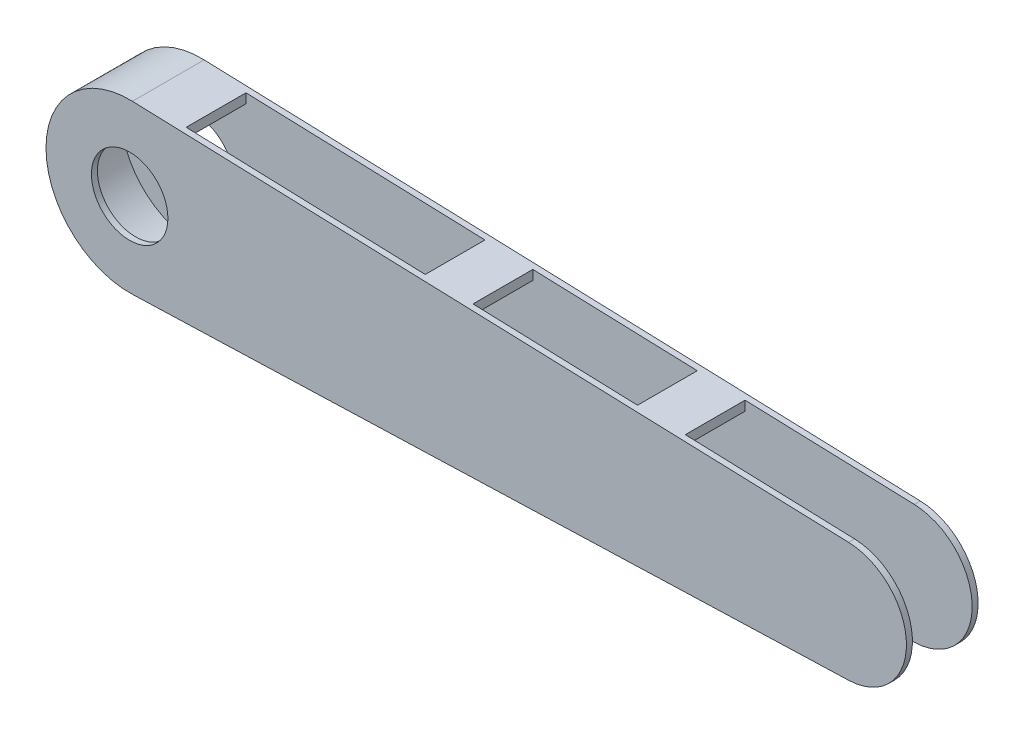
ISO-10303-21;
HEADER;
FILE_DESCRIPTION(('STEP AP214'),'2;1');
FILE_NAME('part.step','',(''),(''),'','','');
FILE_SCHEMA(('AUTOMOTIVE_DESIGN { 1 0 10303 214 1 1 1 1 }'));
ENDSEC;
DATA;
#1=APPLICATION_CONTEXT('core data for automotive mechanical design processes');
#2=APPLICATION_PROTOCOL_DEFINITION('international standard','automotive_design',2000,#1);
#3=PRODUCT_CONTEXT('',#1,'mechanical');
#4=PRODUCT('Part','Part','',(#3));
#5=PRODUCT_RELATED_PRODUCT_CATEGORY('part','',(#4));
#6=PRODUCT_DEFINITION_FORMATION('','',#4);
#7=PRODUCT_DEFINITION_CONTEXT('part definition',#1,'design');
#8=PRODUCT_DEFINITION('design','',#6,#7);
#9=PRODUCT_DEFINITION_SHAPE('','',#8);
#10=(LENGTH_UNIT() NAMED_UNIT(*) SI_UNIT(.MILLI.,.METRE.));
#11=(NAMED_UNIT(*) PLANE_ANGLE_UNIT() SI_UNIT($,.RADIAN.));
#12=(NAMED_UNIT(*) SI_UNIT($,.STERADIAN.) SOLID_ANGLE_UNIT());
#13=UNCERTAINTY_MEASURE_WITH_UNIT(LENGTH_MEASURE(1.E-05),#10,'distance_accuracy_value','');
#14=(GEOMETRIC_REPRESENTATION_CONTEXT(3) GLOBAL_UNCERTAINTY_ASSIGNED_CONTEXT((#13)) GLOBAL_UNIT_ASSIGNED_CONTEXT((#10,
#11,#12)) REPRESENTATION_CONTEXT('',''));
#15=CARTESIAN_POINT('',(0.,0.,0.));
#16=DIRECTION('',(0.,0.,1.));
#17=DIRECTION('',(1.,0.,0.));
#18=AXIS2_PLACEMENT_3D('',#15,#16,#17);
#19=CARTESIAN_POINT('',(1.16666666666667,34.9805501513182,-15.));
#20=DIRECTION('',(0.0333333333333333,0.999444290037663,0.));
#21=DIRECTION('',(-0.999444290037663,0.0333333333333333,0.));
#22=AXIS2_PLACEMENT_3D('',#19,#20,#21);
#23=PLANE('',#22);
#24=DIRECTION('',(0.,0.,1.));
#25=VECTOR('',#24,1.);
#26=CARTESIAN_POINT('',(230.,27.3485311845679,-12.5));
#27=LINE('',#26,#25);
#28=CARTESIAN_POINT('',(230.,27.3485311845679,-12.5));
#29=VERTEX_POINT('',#28);
#30=CARTESIAN_POINT('',(230.,27.3485311845679,12.5));
#31=VERTEX_POINT('',#30);
#32=EDGE_CURVE('E250',#29,#31,#27,.T.);
#33=ORIENTED_EDGE('',*,*,#32,.F.);
#34=DIRECTION('',(-0.999444290037663,0.0333333333333334,0.));
#35=VECTOR('',#34,1.);
#36=CARTESIAN_POINT('',(300.833333333333,24.9861072509416,-12.5));
#37=LINE('',#36,#35);
#38=CARTESIAN_POINT('',(300.833333333333,24.9861072509416,-12.5));
#39=VERTEX_POINT('',#38);
#40=EDGE_CURVE('E235',#39,#29,#37,.T.);
#41=ORIENTED_EDGE('',*,*,#40,.F.);
#42=DIRECTION('',(0.,0.,1.));
#43=VECTOR('',#42,1.);
#44=CARTESIAN_POINT('',(300.833333333333,24.9861072509416,-15.));
#45=LINE('',#44,#43);
#46=CARTESIAN_POINT('',(300.833333333333,24.9861072509416,-15.));
#47=VERTEX_POINT('',#46);
#48=EDGE_CURVE('E52',#47,#39,#45,.T.);
#49=ORIENTED_EDGE('',*,*,#48,.F.);
#50=DIRECTION('',(-0.999444290037663,0.0333333333333333,0.));
#51=VECTOR('',#50,1.);
#52=CARTESIAN_POINT('',(1.16666666666667,34.9805501513182,-15.));
#53=LINE('',#52,#51);
#54=CARTESIAN_POINT('',(1.16666666666667,34.9805501513182,-15.));
#55=VERTEX_POINT('',#54);
#56=EDGE_CURVE('E265',#47,#55,#53,.T.);
#57=ORIENTED_EDGE('',*,*,#56,.T.);
#58=DIRECTION('',(0.,0.,1.));
#59=VECTOR('',#58,1.);
#60=CARTESIAN_POINT('',(1.16666666666667,34.9805501513182,-15.));
#61=LINE('',#60,#59);
#62=CARTESIAN_POINT('',(1.16666666666667,34.9805501513182,15.));
#63=VERTEX_POINT('',#62);
#64=EDGE_CURVE('E11',#55,#63,#61,.T.);
#65=ORIENTED_EDGE('',*,*,#64,.T.);
#66=DIRECTION('',(-0.999444290037663,0.0333333333333333,0.));
#67=VECTOR('',#66,1.);
#68=CARTESIAN_POINT('',(1.16666666666667,34.9805501513182,15.));
#69=LINE('',#68,#67);
#70=CARTESIAN_POINT('',(300.833333333333,24.9861072509416,15.));
#71=VERTEX_POINT('',#70);
#72=EDGE_CURVE('E337',#71,#63,#69,.T.);
#73=ORIENTED_EDGE('',*,*,#72,.F.);
#74=CARTESIAN_POINT('',(300.833333333333,24.9861072509416,12.5));
#75=VERTEX_POINT('',#74);
#76=EDGE_CURVE('E257',#75,#71,#45,.T.);
#77=ORIENTED_EDGE('',*,*,#76,.F.);
#78=DIRECTION('',(-0.999444290037663,0.0333333333333334,0.));
#79=VECTOR('',#78,1.);
#80=CARTESIAN_POINT('',(300.833333333333,24.9861072509416,12.5));
#81=LINE('',#80,#79);
#82=EDGE_CURVE('E367',#75,#31,#81,.T.);
#83=ORIENTED_EDGE('',*,*,#82,.T.);
#84=EDGE_LOOP('',(#33,#41,#49,#57,#65,#73,#77,#83));
#85=FACE_BOUND('',#84,.T.);
#86=DIRECTION('',(0.,0.,1.));
#87=VECTOR('',#86,1.);
#88=CARTESIAN_POINT('',(141.166666666667,30.3112887295627,-12.5));
#89=LINE('',#88,#87);
#90=CARTESIAN_POINT('',(141.166666666667,30.3112887295627,-12.5));
#91=VERTEX_POINT('',#90);
#92=CARTESIAN_POINT('',(141.166666666667,30.3112887295627,12.5));
#93=VERTEX_POINT('',#92);
#94=EDGE_CURVE('E317',#91,#93,#89,.T.);
#95=ORIENTED_EDGE('',*,*,#94,.F.);
#96=DIRECTION('',(-0.999444290037663,0.0333333333333333,0.));
#97=VECTOR('',#96,1.);
#98=CARTESIAN_POINT('',(210.,28.0155685305329,-12.5));
#99=LINE('',#98,#97);
#100=CARTESIAN_POINT('',(210.,28.0155685305329,-12.5));
#101=VERTEX_POINT('',#100);
#102=EDGE_CURVE('E614',#101,#91,#99,.T.);
#103=ORIENTED_EDGE('',*,*,#102,.F.);
#104=DIRECTION('',(0.,0.,1.));
#105=VECTOR('',#104,1.);
#106=CARTESIAN_POINT('',(210.,28.0155685305329,-12.5));
#107=LINE('',#106,#105);
#108=CARTESIAN_POINT('',(210.,28.0155685305329,12.5));
#109=VERTEX_POINT('',#108);
#110=EDGE_CURVE('E319',#101,#109,#107,.T.);
#111=ORIENTED_EDGE('',*,*,#110,.T.);
#112=DIRECTION('',(-0.999444290037663,0.0333333333333333,0.));
#113=VECTOR('',#112,1.);
#114=CARTESIAN_POINT('',(210.,28.0155685305329,12.5));
#115=LINE('',#114,#113);
#116=EDGE_CURVE('E382',#109,#93,#115,.T.);
#117=ORIENTED_EDGE('',*,*,#116,.T.);
#118=EDGE_LOOP('',(#95,#103,#111,#117));
#119=FACE_BOUND('',#118,.T.);
#120=DIRECTION('',(0.,0.,1.));
#121=VECTOR('',#120,1.);
#122=CARTESIAN_POINT('',(21.1666666666667,34.3135128053531,-12.5));
#123=LINE('',#122,#121);
#124=CARTESIAN_POINT('',(21.1666666666667,34.3135128053531,-12.5));
#125=VERTEX_POINT('',#124);
#126=CARTESIAN_POINT('',(21.1666666666665,34.3135128053531,12.5));
#127=VERTEX_POINT('',#126);
#128=EDGE_CURVE('E308',#125,#127,#123,.T.);
#129=ORIENTED_EDGE('',*,*,#128,.F.);
#130=DIRECTION('',(-0.999444290037663,0.0333333333333333,0.));
#131=VECTOR('',#130,1.);
#132=CARTESIAN_POINT('',(121.166666666667,30.9783260755278,-12.5));
#133=LINE('',#132,#131);
#134=CARTESIAN_POINT('',(121.166666666667,30.9783260755278,-12.5));
#135=VERTEX_POINT('',#134);
#136=EDGE_CURVE('E619',#135,#125,#133,.T.);
#137=ORIENTED_EDGE('',*,*,#136,.F.);
#138=DIRECTION('',(0.,0.,1.));
#139=VECTOR('',#138,1.);
#140=CARTESIAN_POINT('',(121.166666666667,30.9783260755278,-12.5));
#141=LINE('',#140,#139);
#142=CARTESIAN_POINT('',(121.166666666667,30.9783260755278,12.5));
#143=VERTEX_POINT('',#142);
#144=EDGE_CURVE('E310',#135,#143,#141,.T.);
#145=ORIENTED_EDGE('',*,*,#144,.T.);
#146=DIRECTION('',(-0.999444290037663,0.0333333333333333,0.));
#147=VECTOR('',#146,1.);
#148=CARTESIAN_POINT('',(121.166666666667,30.9783260755278,12.5));
#149=LINE('',#148,#147);
#150=EDGE_CURVE('E392',#143,#127,#149,.T.);
#151=ORIENTED_EDGE('',*,*,#150,.T.);
#152=EDGE_LOOP('',(#129,#137,#145,#151));
#153=FACE_BOUND('',#152,.T.);
#154=ADVANCED_FACE('F43',(#85,#119,#153),#23,.T.);
#155=CARTESIAN_POINT('',(300.,0.,-15.));
#156=DIRECTION('',(0.,0.,1.));
#157=DIRECTION('',(1.,0.,0.));
#158=AXIS2_PLACEMENT_3D('',#155,#156,#157);
#159=CYLINDRICAL_SURFACE('',#158,25.);
#160=ORIENTED_EDGE('',*,*,#48,.T.);
#161=CARTESIAN_POINT('',(300.,0.,-12.5));
#162=DIRECTION('',(0.,0.,1.));
#163=DIRECTION('',(1.,0.,0.));
#164=AXIS2_PLACEMENT_3D('',#161,#162,#163);
#165=CIRCLE('',#164,25.);
#166=CARTESIAN_POINT('',(300.833333333333,-24.9861072509416,-12.5));
#167=VERTEX_POINT('',#166);
#168=EDGE_CURVE('E230',#167,#39,#165,.T.);
#169=ORIENTED_EDGE('',*,*,#168,.F.);
#170=DIRECTION('',(0.,0.,1.));
#171=VECTOR('',#170,1.);
#172=CARTESIAN_POINT('',(300.833333333333,-24.9861072509416,-15.));
#173=LINE('',#172,#171);
#174=CARTESIAN_POINT('',(300.833333333333,-24.9861072509416,-15.));
#175=VERTEX_POINT('',#174);
#176=EDGE_CURVE('E259',#175,#167,#173,.T.);
#177=ORIENTED_EDGE('',*,*,#176,.F.);
#178=CARTESIAN_POINT('',(300.,0.,-15.));
#179=DIRECTION('',(0.,0.,1.));
#180=DIRECTION('',(1.,0.,0.));
#181=AXIS2_PLACEMENT_3D('',#178,#179,#180);
#182=CIRCLE('',#181,25.);
#183=EDGE_CURVE('E255',#175,#47,#182,.T.);
#184=ORIENTED_EDGE('',*,*,#183,.T.);
#185=EDGE_LOOP('',(#160,#169,#177,#184));
#186=FACE_BOUND('',#185,.T.);
#187=ADVANCED_FACE('F253',(#186),#159,.T.);
#188=CARTESIAN_POINT('',(1.16666666666667,-34.9805501513182,-15.));
#189=DIRECTION('',(0.0333333333333333,-0.999444290037663,0.));
#190=DIRECTION('',(0.999444290037663,0.0333333333333333,0.));
#191=AXIS2_PLACEMENT_3D('',#188,#189,#190);
#192=PLANE('',#191);
#193=DIRECTION('',(0.,0.,1.));
#194=VECTOR('',#193,1.);
#195=CARTESIAN_POINT('',(121.166666666667,-30.9783260755278,-12.5));
#196=LINE('',#195,#194);
#197=CARTESIAN_POINT('',(121.166666666667,-30.9783260755278,-12.5));
#198=VERTEX_POINT('',#197);
#199=CARTESIAN_POINT('',(121.166666666667,-30.9783260755278,12.5));
#200=VERTEX_POINT('',#199);
#201=EDGE_CURVE('E294',#198,#200,#196,.T.);
#202=ORIENTED_EDGE('',*,*,#201,.F.);
#203=DIRECTION('',(0.999444290037663,0.0333333333333333,0.));
#204=VECTOR('',#203,1.);
#205=CARTESIAN_POINT('',(21.1666666666667,-34.3135128053531,-12.5));
#206=LINE('',#205,#204);
#207=CARTESIAN_POINT('',(21.1666666666667,-34.3135128053531,-12.5));
#208=VERTEX_POINT('',#207);
#209=EDGE_CURVE('E626',#208,#198,#206,.T.);
#210=ORIENTED_EDGE('',*,*,#209,.F.);
#211=DIRECTION('',(0.,0.,1.));
#212=VECTOR('',#211,1.);
#213=CARTESIAN_POINT('',(21.1666666666667,-34.3135128053531,-12.5));
#214=LINE('',#213,#212);
#215=CARTESIAN_POINT('',(21.1666666666667,-34.3135128053531,12.5));
#216=VERTEX_POINT('',#215);
#217=EDGE_CURVE('E297',#208,#216,#214,.T.);
#218=ORIENTED_EDGE('',*,*,#217,.T.);
#219=DIRECTION('',(0.999444290037663,0.0333333333333333,0.));
#220=VECTOR('',#219,1.);
#221=CARTESIAN_POINT('',(21.1666666666667,-34.3135128053531,12.5));
#222=LINE('',#221,#220);
#223=EDGE_CURVE('E408',#216,#200,#222,.T.);
#224=ORIENTED_EDGE('',*,*,#223,.T.);
#225=EDGE_LOOP('',(#202,#210,#218,#224));
#226=FACE_BOUND('',#225,.T.);
#227=DIRECTION('',(0.,0.,1.));
#228=VECTOR('',#227,1.);
#229=CARTESIAN_POINT('',(210.,-28.0155685305329,-12.5));
#230=LINE('',#229,#228);
#231=CARTESIAN_POINT('',(210.,-28.0155685305329,-12.5));
#232=VERTEX_POINT('',#231);
#233=CARTESIAN_POINT('',(210.,-28.0155685305329,12.5));
#234=VERTEX_POINT('',#233);
#235=EDGE_CURVE('E284',#232,#234,#230,.T.);
#236=ORIENTED_EDGE('',*,*,#235,.F.);
#237=DIRECTION('',(0.999444290037663,0.0333333333333333,0.));
#238=VECTOR('',#237,1.);
#239=CARTESIAN_POINT('',(141.166666666667,-30.3112887295627,-12.5));
#240=LINE('',#239,#238);
#241=CARTESIAN_POINT('',(141.166666666667,-30.3112887295627,-12.5));
#242=VERTEX_POINT('',#241);
#243=EDGE_CURVE('E472',#242,#232,#240,.T.);
#244=ORIENTED_EDGE('',*,*,#243,.F.);
#245=DIRECTION('',(0.,0.,1.));
#246=VECTOR('',#245,1.);
#247=CARTESIAN_POINT('',(141.166666666667,-30.3112887295627,-12.5));
#248=LINE('',#247,#246);
#249=CARTESIAN_POINT('',(141.166666666667,-30.3112887295627,12.5));
#250=VERTEX_POINT('',#249);
#251=EDGE_CURVE('E287',#242,#250,#248,.T.);
#252=ORIENTED_EDGE('',*,*,#251,.T.);
#253=DIRECTION('',(0.999444290037663,0.0333333333333333,0.));
#254=VECTOR('',#253,1.);
#255=CARTESIAN_POINT('',(141.166666666667,-30.3112887295627,12.5));
#256=LINE('',#255,#254);
#257=EDGE_CURVE('E420',#250,#234,#256,.T.);
#258=ORIENTED_EDGE('',*,*,#257,.T.);
#259=EDGE_LOOP('',(#236,#244,#252,#258));
#260=FACE_BOUND('',#259,.T.);
#261=ORIENTED_EDGE('',*,*,#176,.T.);
#262=DIRECTION('',(0.999444290037663,0.0333333333333333,0.));
#263=VECTOR('',#262,1.);
#264=CARTESIAN_POINT('',(230.,-27.3485311845679,-12.5));
#265=LINE('',#264,#263);
#266=CARTESIAN_POINT('',(230.,-27.3485311845679,-12.5));
#267=VERTEX_POINT('',#266);
#268=EDGE_CURVE('E239',#267,#167,#265,.T.);
#269=ORIENTED_EDGE('',*,*,#268,.F.);
#270=DIRECTION('',(0.,0.,1.));
#271=VECTOR('',#270,1.);
#272=CARTESIAN_POINT('',(230.,-27.3485311845679,-12.5));
#273=LINE('',#272,#271);
#274=CARTESIAN_POINT('',(230.,-27.3485311845679,12.5));
#275=VERTEX_POINT('',#274);
#276=EDGE_CURVE('E268',#267,#275,#273,.T.);
#277=ORIENTED_EDGE('',*,*,#276,.T.);
#278=DIRECTION('',(0.999444290037663,0.0333333333333333,0.));
#279=VECTOR('',#278,1.);
#280=CARTESIAN_POINT('',(230.,-27.3485311845679,12.5));
#281=LINE('',#280,#279);
#282=CARTESIAN_POINT('',(300.833333333333,-24.9861072509416,12.5));
#283=VERTEX_POINT('',#282);
#284=EDGE_CURVE('E243',#275,#283,#281,.T.);
#285=ORIENTED_EDGE('',*,*,#284,.T.);
#286=CARTESIAN_POINT('',(300.833333333333,-24.9861072509416,15.));
#287=VERTEX_POINT('',#286);
#288=EDGE_CURVE('E263',#283,#287,#173,.T.);
#289=ORIENTED_EDGE('',*,*,#288,.T.);
#290=DIRECTION('',(0.999444290037663,0.0333333333333333,0.));
#291=VECTOR('',#290,1.);
#292=CARTESIAN_POINT('',(1.16666666666667,-34.9805501513182,15.));
#293=LINE('',#292,#291);
#294=CARTESIAN_POINT('',(1.16666666666667,-34.9805501513182,15.));
#295=VERTEX_POINT('',#294);
#296=EDGE_CURVE('E344',#295,#287,#293,.T.);
#297=ORIENTED_EDGE('',*,*,#296,.F.);
#298=DIRECTION('',(0.,0.,1.));
#299=VECTOR('',#298,1.);
#300=CARTESIAN_POINT('',(1.16666666666667,-34.9805501513182,-15.));
#301=LINE('',#300,#299);
#302=CARTESIAN_POINT('',(1.16666666666667,-34.9805501513182,-15.));
#303=VERTEX_POINT('',#302);
#304=EDGE_CURVE('E264',#303,#295,#301,.T.);
#305=ORIENTED_EDGE('',*,*,#304,.F.);
#306=DIRECTION('',(0.999444290037663,0.0333333333333333,0.));
#307=VECTOR('',#306,1.);
#308=CARTESIAN_POINT('',(1.16666666666667,-34.9805501513182,-15.));
#309=LINE('',#308,#307);
#310=EDGE_CURVE('E336',#303,#175,#309,.T.);
#311=ORIENTED_EDGE('',*,*,#310,.T.);
#312=EDGE_LOOP('',(#261,#269,#277,#285,#289,#297,#305,#311));
#313=FACE_BOUND('',#312,.T.);
#314=ADVANCED_FACE('F360',(#226,#260,#313),#192,.T.);
#315=CARTESIAN_POINT('',(0.,3.3521882545141E-13,-15.));
#316=DIRECTION('',(0.,0.,1.));
#317=DIRECTION('',(1.,0.,0.));
#318=AXIS2_PLACEMENT_3D('',#315,#316,#317);
#319=CYLINDRICAL_SURFACE('',#318,16.0000000000001);
#320=CARTESIAN_POINT('',(0.,3.3521882545141E-13,-15.));
#321=DIRECTION('',(0.,0.,1.));
#322=DIRECTION('',(1.,0.,0.));
#323=AXIS2_PLACEMENT_3D('',#320,#321,#322);
#324=CIRCLE('',#323,16.0000000000001);
#325=CARTESIAN_POINT('',(16.0000000000001,3.3521882545141E-13,-15.));
#326=VERTEX_POINT('',#325);
#327=EDGE_CURVE('E329',#326,#326,#324,.T.);
#328=ORIENTED_EDGE('',*,*,#327,.F.);
#329=EDGE_LOOP('',(#328));
#330=FACE_BOUND('',#329,.T.);
#331=CARTESIAN_POINT('',(0.,3.3521882545141E-13,-12.5));
#332=DIRECTION('',(0.,0.,1.));
#333=DIRECTION('',(1.,0.,0.));
#334=AXIS2_PLACEMENT_3D('',#331,#332,#333);
#335=CIRCLE('',#334,16.0000000000001);
#336=CARTESIAN_POINT('',(16.0000000000001,3.3521882545141E-13,-12.5));
#337=VERTEX_POINT('',#336);
#338=EDGE_CURVE('E47',#337,#337,#335,.F.);
#339=ORIENTED_EDGE('',*,*,#338,.F.);
#340=EDGE_LOOP('',(#339));
#341=FACE_BOUND('',#340,.T.);
#342=ADVANCED_FACE('F458',(#330,#341),#319,.F.);
#343=CARTESIAN_POINT('',(0.,0.,-15.));
#344=DIRECTION('',(0.,0.,1.));
#345=DIRECTION('',(1.,0.,0.));
#346=AXIS2_PLACEMENT_3D('',#343,#344,#345);
#347=CYLINDRICAL_SURFACE('',#346,35.);
#348=CARTESIAN_POINT('',(0.,0.,15.));
#349=DIRECTION('',(0.,0.,1.));
#350=DIRECTION('',(1.,0.,0.));
#351=AXIS2_PLACEMENT_3D('',#348,#349,#350);
#352=CIRCLE('',#351,35.);
#353=EDGE_CURVE('E332',#63,#295,#352,.T.);
#354=ORIENTED_EDGE('',*,*,#353,.F.);
#355=ORIENTED_EDGE('',*,*,#64,.F.);
#356=CARTESIAN_POINT('',(0.,0.,-15.));
#357=DIRECTION('',(0.,0.,1.));
#358=DIRECTION('',(1.,0.,0.));
#359=AXIS2_PLACEMENT_3D('',#356,#357,#358);
#360=CIRCLE('',#359,35.);
#361=EDGE_CURVE('E333',#55,#303,#360,.T.);
#362=ORIENTED_EDGE('',*,*,#361,.T.);
#363=ORIENTED_EDGE('',*,*,#304,.T.);
#364=EDGE_LOOP('',(#354,#355,#362,#363));
#365=FACE_BOUND('',#364,.T.);
#366=ADVANCED_FACE('F45',(#365),#347,.T.);
#367=CARTESIAN_POINT('',(300.,0.,12.5));
#368=DIRECTION('',(0.,0.,1.));
#369=DIRECTION('',(1.,0.,0.));
#370=AXIS2_PLACEMENT_3D('',#367,#368,#369);
#371=CIRCLE('',#370,25.);
#372=EDGE_CURVE('E366',#283,#75,#371,.T.);
#373=ORIENTED_EDGE('',*,*,#372,.T.);
#374=ORIENTED_EDGE('',*,*,#76,.T.);
#375=CARTESIAN_POINT('',(300.,0.,15.));
#376=DIRECTION('',(0.,0.,1.));
#377=DIRECTION('',(1.,0.,0.));
#378=AXIS2_PLACEMENT_3D('',#375,#376,#377);
#379=CIRCLE('',#378,25.);
#380=EDGE_CURVE('E347',#287,#71,#379,.T.);
#381=ORIENTED_EDGE('',*,*,#380,.F.);
#382=ORIENTED_EDGE('',*,*,#288,.F.);
#383=EDGE_LOOP('',(#373,#374,#381,#382));
#384=FACE_BOUND('',#383,.T.);
#385=ADVANCED_FACE('F365',(#384),#159,.T.);
#386=CARTESIAN_POINT('',(0.,0.,-15.));
#387=DIRECTION('',(0.,0.,1.));
#388=DIRECTION('',(1.,0.,0.));
#389=AXIS2_PLACEMENT_3D('',#386,#387,#388);
#390=PLANE('',#389);
#391=ORIENTED_EDGE('',*,*,#327,.T.);
#392=EDGE_LOOP('',(#391));
#393=FACE_BOUND('',#392,.T.);
#394=ORIENTED_EDGE('',*,*,#361,.F.);
#395=ORIENTED_EDGE('',*,*,#56,.F.);
#396=ORIENTED_EDGE('',*,*,#183,.F.);
#397=ORIENTED_EDGE('',*,*,#310,.F.);
#398=EDGE_LOOP('',(#394,#395,#396,#397));
#399=FACE_BOUND('',#398,.T.);
#400=ADVANCED_FACE('F456',(#393,#399),#390,.F.);
#401=CARTESIAN_POINT('',(0.,0.,15.));
#402=DIRECTION('',(0.,0.,1.));
#403=DIRECTION('',(1.,0.,0.));
#404=AXIS2_PLACEMENT_3D('',#401,#402,#403);
#405=PLANE('',#404);
#406=CARTESIAN_POINT('',(0.,3.3521882545141E-13,15.));
#407=DIRECTION('',(0.,0.,1.));
#408=DIRECTION('',(1.,0.,0.));
#409=AXIS2_PLACEMENT_3D('',#406,#407,#408);
#410=CIRCLE('',#409,16.0000000000001);
#411=CARTESIAN_POINT('',(16.0000000000001,3.3521882545141E-13,15.));
#412=VERTEX_POINT('',#411);
#413=EDGE_CURVE('E272',#412,#412,#410,.T.);
#414=ORIENTED_EDGE('',*,*,#413,.F.);
#415=EDGE_LOOP('',(#414));
#416=FACE_BOUND('',#415,.T.);
#417=ORIENTED_EDGE('',*,*,#353,.T.);
#418=ORIENTED_EDGE('',*,*,#296,.T.);
#419=ORIENTED_EDGE('',*,*,#380,.T.);
#420=ORIENTED_EDGE('',*,*,#72,.T.);
#421=EDGE_LOOP('',(#417,#418,#419,#420));
#422=FACE_BOUND('',#421,.T.);
#423=ADVANCED_FACE('F352',(#416,#422),#405,.T.);
#424=CARTESIAN_POINT('',(0.,3.3521882545141E-13,12.5));
#425=DIRECTION('',(0.,0.,1.));
#426=DIRECTION('',(1.,0.,0.));
#427=AXIS2_PLACEMENT_3D('',#424,#425,#426);
#428=CIRCLE('',#427,16.0000000000001);
#429=CARTESIAN_POINT('',(16.0000000000001,3.3521882545141E-13,12.5));
#430=VERTEX_POINT('',#429);
#431=EDGE_CURVE('E266',#430,#430,#428,.F.);
#432=ORIENTED_EDGE('',*,*,#431,.T.);
#433=EDGE_LOOP('',(#432));
#434=FACE_BOUND('',#433,.T.);
#435=ORIENTED_EDGE('',*,*,#413,.T.);
#436=EDGE_LOOP('',(#435));
#437=FACE_BOUND('',#436,.T.);
#438=ADVANCED_FACE('F444',(#434,#437),#319,.F.);
#439=CARTESIAN_POINT('',(300.,0.,-12.5));
#440=DIRECTION('',(0.,0.,1.));
#441=DIRECTION('',(1.,0.,0.));
#442=AXIS2_PLACEMENT_3D('',#439,#440,#441);
#443=PLANE('',#442);
#444=ORIENTED_EDGE('',*,*,#168,.T.);
#445=ORIENTED_EDGE('',*,*,#40,.T.);
#446=DIRECTION('',(0.,-1.,0.));
#447=VECTOR('',#446,1.);
#448=CARTESIAN_POINT('',(230.,27.3485311845679,-12.5));
#449=LINE('',#448,#447);
#450=CARTESIAN_POINT('',(230.,23.3463071087775,-12.5));
#451=VERTEX_POINT('',#450);
#452=EDGE_CURVE('E251',#29,#451,#449,.T.);
#453=ORIENTED_EDGE('',*,*,#452,.T.);
#454=DIRECTION('',(-0.999444290037663,0.0333333333333332,0.));
#455=VECTOR('',#454,1.);
#456=CARTESIAN_POINT('',(230.,23.3463071087775,-12.5));
#457=LINE('',#456,#455);
#458=CARTESIAN_POINT('',(210.,24.0133444547425,-12.5));
#459=VERTEX_POINT('',#458);
#460=EDGE_CURVE('E608',#451,#459,#457,.T.);
#461=ORIENTED_EDGE('',*,*,#460,.T.);
#462=DIRECTION('',(0.,1.,0.));
#463=VECTOR('',#462,1.);
#464=CARTESIAN_POINT('',(210.,28.0155685305329,-12.5));
#465=LINE('',#464,#463);
#466=EDGE_CURVE('E605',#459,#101,#465,.T.);
#467=ORIENTED_EDGE('',*,*,#466,.T.);
#468=ORIENTED_EDGE('',*,*,#102,.T.);
#469=DIRECTION('',(0.,-1.,0.));
#470=VECTOR('',#469,1.);
#471=CARTESIAN_POINT('',(141.166666666667,30.3112887295627,-12.5));
#472=LINE('',#471,#470);
#473=CARTESIAN_POINT('',(141.166666666667,26.3090646537723,-12.5));
#474=VERTEX_POINT('',#473);
#475=EDGE_CURVE('E598',#91,#474,#472,.T.);
#476=ORIENTED_EDGE('',*,*,#475,.T.);
#477=DIRECTION('',(-0.999444290037663,0.0333333333333332,0.));
#478=VECTOR('',#477,1.);
#479=CARTESIAN_POINT('',(141.166666666667,26.3090646537723,-12.5));
#480=LINE('',#479,#478);
#481=CARTESIAN_POINT('',(121.166666666667,26.9761019997374,-12.5));
#482=VERTEX_POINT('',#481);
#483=EDGE_CURVE('E595',#474,#482,#480,.T.);
#484=ORIENTED_EDGE('',*,*,#483,.T.);
#485=DIRECTION('',(0.,1.,0.));
#486=VECTOR('',#485,1.);
#487=CARTESIAN_POINT('',(121.166666666667,30.9783260755278,-12.5));
#488=LINE('',#487,#486);
#489=EDGE_CURVE('E592',#482,#135,#488,.T.);
#490=ORIENTED_EDGE('',*,*,#489,.T.);
#491=ORIENTED_EDGE('',*,*,#136,.T.);
#492=DIRECTION('',(0.,-1.,0.));
#493=VECTOR('',#492,1.);
#494=CARTESIAN_POINT('',(21.1666666666667,34.3135128053531,-12.5));
#495=LINE('',#494,#493);
#496=CARTESIAN_POINT('',(21.1666666666667,30.3112887295627,-12.5));
#497=VERTEX_POINT('',#496);
#498=EDGE_CURVE('E585',#125,#497,#495,.T.);
#499=ORIENTED_EDGE('',*,*,#498,.T.);
#500=DIRECTION('',(-0.999444290037663,0.0333333333333334,0.));
#501=VECTOR('',#500,1.);
#502=CARTESIAN_POINT('',(21.1666666666667,30.3112887295627,-12.5));
#503=LINE('',#502,#501);
#504=CARTESIAN_POINT('',(1.0333333333332,30.9827729911676,-12.5));
#505=VERTEX_POINT('',#504);
#506=EDGE_CURVE('E582',#497,#505,#503,.T.);
#507=ORIENTED_EDGE('',*,*,#506,.T.);
#508=CARTESIAN_POINT('',(0.,0.,-12.5));
#509=DIRECTION('',(0.,0.,1.));
#510=DIRECTION('',(1.,0.,0.));
#511=AXIS2_PLACEMENT_3D('',#508,#509,#510);
#512=CIRCLE('',#511,31.);
#513=CARTESIAN_POINT('',(1.03333333333333,-30.9827729911676,-12.5));
#514=VERTEX_POINT('',#513);
#515=EDGE_CURVE('E579',#505,#514,#512,.T.);
#516=ORIENTED_EDGE('',*,*,#515,.T.);
#517=DIRECTION('',(0.999444290037663,0.0333333333333334,0.));
#518=VECTOR('',#517,1.);
#519=CARTESIAN_POINT('',(1.03333333333333,-30.9827729911676,-12.5));
#520=LINE('',#519,#518);
#521=CARTESIAN_POINT('',(21.1666666666667,-30.3112887295627,-12.5));
#522=VERTEX_POINT('',#521);
#523=EDGE_CURVE('E575',#514,#522,#520,.T.);
#524=ORIENTED_EDGE('',*,*,#523,.T.);
#525=DIRECTION('',(0.,-1.,0.));
#526=VECTOR('',#525,1.);
#527=CARTESIAN_POINT('',(21.1666666666667,-30.3112887295627,-12.5));
#528=LINE('',#527,#526);
#529=EDGE_CURVE('E572',#522,#208,#528,.T.);
#530=ORIENTED_EDGE('',*,*,#529,.T.);
#531=ORIENTED_EDGE('',*,*,#209,.T.);
#532=DIRECTION('',(0.,1.,0.));
#533=VECTOR('',#532,1.);
#534=CARTESIAN_POINT('',(121.166666666667,-26.9761019997374,-12.5));
#535=LINE('',#534,#533);
#536=CARTESIAN_POINT('',(121.166666666667,-26.9761019997374,-12.5));
#537=VERTEX_POINT('',#536);
#538=EDGE_CURVE('E566',#198,#537,#535,.T.);
#539=ORIENTED_EDGE('',*,*,#538,.T.);
#540=DIRECTION('',(0.999444290037663,0.0333333333333333,0.));
#541=VECTOR('',#540,1.);
#542=CARTESIAN_POINT('',(121.166666666667,-26.9761019997374,-12.5));
#543=LINE('',#542,#541);
#544=CARTESIAN_POINT('',(141.166666666667,-26.3090646537723,-12.5));
#545=VERTEX_POINT('',#544);
#546=EDGE_CURVE('E486',#537,#545,#543,.T.);
#547=ORIENTED_EDGE('',*,*,#546,.T.);
#548=DIRECTION('',(0.,-1.,0.));
#549=VECTOR('',#548,1.);
#550=CARTESIAN_POINT('',(141.166666666667,-26.3090646537723,-12.5));
#551=LINE('',#550,#549);
#552=EDGE_CURVE('E484',#545,#242,#551,.T.);
#553=ORIENTED_EDGE('',*,*,#552,.T.);
#554=ORIENTED_EDGE('',*,*,#243,.T.);
#555=DIRECTION('',(0.,1.,0.));
#556=VECTOR('',#555,1.);
#557=CARTESIAN_POINT('',(210.,-24.0133444547425,-12.5));
#558=LINE('',#557,#556);
#559=CARTESIAN_POINT('',(210.,-24.0133444547425,-12.5));
#560=VERTEX_POINT('',#559);
#561=EDGE_CURVE('E476',#232,#560,#558,.T.);
#562=ORIENTED_EDGE('',*,*,#561,.T.);
#563=DIRECTION('',(0.999444290037663,0.0333333333333332,0.));
#564=VECTOR('',#563,1.);
#565=CARTESIAN_POINT('',(210.,-24.0133444547425,-12.5));
#566=LINE('',#565,#564);
#567=CARTESIAN_POINT('',(230.,-23.3463071087775,-12.5));
#568=VERTEX_POINT('',#567);
#569=EDGE_CURVE('E479',#560,#568,#566,.T.);
#570=ORIENTED_EDGE('',*,*,#569,.T.);
#571=DIRECTION('',(0.,-1.,0.));
#572=VECTOR('',#571,1.);
#573=CARTESIAN_POINT('',(230.,-23.3463071087775,-12.5));
#574=LINE('',#573,#572);
#575=EDGE_CURVE('E490',#568,#267,#574,.T.);
#576=ORIENTED_EDGE('',*,*,#575,.T.);
#577=ORIENTED_EDGE('',*,*,#268,.T.);
#578=EDGE_LOOP('',(#444,#445,#453,#461,#467,#468,#476,#484,#490,#491,#499,#507,#516,#524,#530,
#531,#539,#547,#553,#554,#562,#570,#576,#577));
#579=FACE_BOUND('',#578,.T.);
#580=ORIENTED_EDGE('',*,*,#338,.T.);
#581=EDGE_LOOP('',(#580));
#582=FACE_BOUND('',#581,.T.);
#583=ADVANCED_FACE('F232',(#579,#582),#443,.T.);
#584=CARTESIAN_POINT('',(300.,0.,12.5));
#585=DIRECTION('',(0.,0.,1.));
#586=DIRECTION('',(1.,0.,0.));
#587=AXIS2_PLACEMENT_3D('',#584,#585,#586);
#588=PLANE('',#587);
#589=ORIENTED_EDGE('',*,*,#372,.F.);
#590=ORIENTED_EDGE('',*,*,#284,.F.);
#591=DIRECTION('',(0.,-1.,0.));
#592=VECTOR('',#591,1.);
#593=CARTESIAN_POINT('',(230.,-23.3463071087775,12.5));
#594=LINE('',#593,#592);
#595=CARTESIAN_POINT('',(230.,-23.3463071087775,12.5));
#596=VERTEX_POINT('',#595);
#597=EDGE_CURVE('E428',#596,#275,#594,.T.);
#598=ORIENTED_EDGE('',*,*,#597,.F.);
#599=DIRECTION('',(0.999444290037663,0.0333333333333332,0.));
#600=VECTOR('',#599,1.);
#601=CARTESIAN_POINT('',(210.,-24.0133444547425,12.5));
#602=LINE('',#601,#600);
#603=CARTESIAN_POINT('',(210.,-24.0133444547425,12.5));
#604=VERTEX_POINT('',#603);
#605=EDGE_CURVE('E426',#604,#596,#602,.T.);
#606=ORIENTED_EDGE('',*,*,#605,.F.);
#607=DIRECTION('',(0.,1.,0.));
#608=VECTOR('',#607,1.);
#609=CARTESIAN_POINT('',(210.,-24.0133444547425,12.5));
#610=LINE('',#609,#608);
#611=EDGE_CURVE('E423',#234,#604,#610,.T.);
#612=ORIENTED_EDGE('',*,*,#611,.F.);
#613=ORIENTED_EDGE('',*,*,#257,.F.);
#614=DIRECTION('',(0.,-1.,0.));
#615=VECTOR('',#614,1.);
#616=CARTESIAN_POINT('',(141.166666666667,-26.3090646537723,12.5));
#617=LINE('',#616,#615);
#618=CARTESIAN_POINT('',(141.166666666667,-26.3090646537723,12.5));
#619=VERTEX_POINT('',#618);
#620=EDGE_CURVE('E417',#619,#250,#617,.T.);
#621=ORIENTED_EDGE('',*,*,#620,.F.);
#622=DIRECTION('',(0.999444290037663,0.0333333333333333,0.));
#623=VECTOR('',#622,1.);
#624=CARTESIAN_POINT('',(121.166666666667,-26.9761019997374,12.5));
#625=LINE('',#624,#623);
#626=CARTESIAN_POINT('',(121.166666666667,-26.9761019997374,12.5));
#627=VERTEX_POINT('',#626);
#628=EDGE_CURVE('E414',#627,#619,#625,.T.);
#629=ORIENTED_EDGE('',*,*,#628,.F.);
#630=DIRECTION('',(0.,1.,0.));
#631=VECTOR('',#630,1.);
#632=CARTESIAN_POINT('',(121.166666666667,-26.9761019997374,12.5));
#633=LINE('',#632,#631);
#634=EDGE_CURVE('E411',#200,#627,#633,.T.);
#635=ORIENTED_EDGE('',*,*,#634,.F.);
#636=ORIENTED_EDGE('',*,*,#223,.F.);
#637=DIRECTION('',(0.,-1.,0.));
#638=VECTOR('',#637,1.);
#639=CARTESIAN_POINT('',(21.1666666666667,-30.3112887295627,12.5));
#640=LINE('',#639,#638);
#641=CARTESIAN_POINT('',(21.1666666666667,-30.3112887295627,12.5));
#642=VERTEX_POINT('',#641);
#643=EDGE_CURVE('E405',#642,#216,#640,.T.);
#644=ORIENTED_EDGE('',*,*,#643,.F.);
#645=DIRECTION('',(0.999444290037663,0.0333333333333334,0.));
#646=VECTOR('',#645,1.);
#647=CARTESIAN_POINT('',(1.03333333333333,-30.9827729911676,12.5));
#648=LINE('',#647,#646);
#649=CARTESIAN_POINT('',(1.03333333333333,-30.9827729911676,12.5));
#650=VERTEX_POINT('',#649);
#651=EDGE_CURVE('E402',#650,#642,#648,.T.);
#652=ORIENTED_EDGE('',*,*,#651,.F.);
#653=CARTESIAN_POINT('',(0.,0.,12.5));
#654=DIRECTION('',(0.,0.,1.));
#655=DIRECTION('',(1.,0.,0.));
#656=AXIS2_PLACEMENT_3D('',#653,#654,#655);
#657=CIRCLE('',#656,31.);
#658=CARTESIAN_POINT('',(1.0333333333332,30.9827729911676,12.5));
#659=VERTEX_POINT('',#658);
#660=EDGE_CURVE('E399',#659,#650,#657,.T.);
#661=ORIENTED_EDGE('',*,*,#660,.F.);
#662=DIRECTION('',(-0.999444290037663,0.0333333333333334,0.));
#663=VECTOR('',#662,1.);
#664=CARTESIAN_POINT('',(21.1666666666667,30.3112887295627,12.5));
#665=LINE('',#664,#663);
#666=CARTESIAN_POINT('',(21.1666666666667,30.3112887295627,12.5));
#667=VERTEX_POINT('',#666);
#668=EDGE_CURVE('E396',#667,#659,#665,.T.);
#669=ORIENTED_EDGE('',*,*,#668,.F.);
#670=DIRECTION('',(0.,-1.,0.));
#671=VECTOR('',#670,1.);
#672=CARTESIAN_POINT('',(21.1666666666667,34.3135128053531,12.5));
#673=LINE('',#672,#671);
#674=EDGE_CURVE('E60',#127,#667,#673,.T.);
#675=ORIENTED_EDGE('',*,*,#674,.F.);
#676=ORIENTED_EDGE('',*,*,#150,.F.);
#677=DIRECTION('',(0.,1.,0.));
#678=VECTOR('',#677,1.);
#679=CARTESIAN_POINT('',(121.166666666667,30.9783260755278,12.5));
#680=LINE('',#679,#678);
#681=CARTESIAN_POINT('',(121.166666666667,26.9761019997374,12.5));
#682=VERTEX_POINT('',#681);
#683=EDGE_CURVE('E389',#682,#143,#680,.T.);
#684=ORIENTED_EDGE('',*,*,#683,.F.);
#685=DIRECTION('',(-0.999444290037663,0.0333333333333332,0.));
#686=VECTOR('',#685,1.);
#687=CARTESIAN_POINT('',(141.166666666667,26.3090646537723,12.5));
#688=LINE('',#687,#686);
#689=CARTESIAN_POINT('',(141.166666666667,26.3090646537723,12.5));
#690=VERTEX_POINT('',#689);
#691=EDGE_CURVE('E386',#690,#682,#688,.T.);
#692=ORIENTED_EDGE('',*,*,#691,.F.);
#693=DIRECTION('',(0.,-1.,0.));
#694=VECTOR('',#693,1.);
#695=CARTESIAN_POINT('',(141.166666666667,30.3112887295627,12.5));
#696=LINE('',#695,#694);
#697=EDGE_CURVE('E67',#93,#690,#696,.T.);
#698=ORIENTED_EDGE('',*,*,#697,.F.);
#699=ORIENTED_EDGE('',*,*,#116,.F.);
#700=DIRECTION('',(0.,1.,0.));
#701=VECTOR('',#700,1.);
#702=CARTESIAN_POINT('',(210.,28.0155685305329,12.5));
#703=LINE('',#702,#701);
#704=CARTESIAN_POINT('',(210.,24.0133444547425,12.5));
#705=VERTEX_POINT('',#704);
#706=EDGE_CURVE('E379',#705,#109,#703,.T.);
#707=ORIENTED_EDGE('',*,*,#706,.F.);
#708=DIRECTION('',(-0.999444290037663,0.0333333333333332,0.));
#709=VECTOR('',#708,1.);
#710=CARTESIAN_POINT('',(230.,23.3463071087775,12.5));
#711=LINE('',#710,#709);
#712=CARTESIAN_POINT('',(230.,23.3463071087775,12.5));
#713=VERTEX_POINT('',#712);
#714=EDGE_CURVE('E376',#713,#705,#711,.T.);
#715=ORIENTED_EDGE('',*,*,#714,.F.);
#716=DIRECTION('',(0.,-1.,0.));
#717=VECTOR('',#716,1.);
#718=CARTESIAN_POINT('',(230.,27.3485311845679,12.5));
#719=LINE('',#718,#717);
#720=EDGE_CURVE('E369',#31,#713,#719,.T.);
#721=ORIENTED_EDGE('',*,*,#720,.F.);
#722=ORIENTED_EDGE('',*,*,#82,.F.);
#723=EDGE_LOOP('',(#589,#590,#598,#606,#612,#613,#621,#629,#635,#636,#644,#652,#661,#669,#675,
#676,#684,#692,#698,#699,#707,#715,#721,#722));
#724=FACE_BOUND('',#723,.T.);
#725=ORIENTED_EDGE('',*,*,#431,.F.);
#726=EDGE_LOOP('',(#725));
#727=FACE_BOUND('',#726,.T.);
#728=ADVANCED_FACE('F434',(#724,#727),#588,.F.);
#729=CARTESIAN_POINT('',(230.,-23.3463071087775,-12.5));
#730=DIRECTION('',(-1.,0.,0.));
#731=DIRECTION('',(0.,0.,1.));
#732=AXIS2_PLACEMENT_3D('',#729,#730,#731);
#733=PLANE('',#732);
#734=ORIENTED_EDGE('',*,*,#597,.T.);
#735=ORIENTED_EDGE('',*,*,#276,.F.);
#736=ORIENTED_EDGE('',*,*,#575,.F.);
#737=DIRECTION('',(0.,0.,1.));
#738=VECTOR('',#737,1.);
#739=CARTESIAN_POINT('',(230.,-23.3463071087775,-12.5));
#740=LINE('',#739,#738);
#741=EDGE_CURVE('E274',#568,#596,#740,.T.);
#742=ORIENTED_EDGE('',*,*,#741,.T.);
#743=EDGE_LOOP('',(#734,#735,#736,#742));
#744=FACE_BOUND('',#743,.T.);
#745=ADVANCED_FACE('F431',(#744),#733,.F.);
#746=CARTESIAN_POINT('',(210.,-24.0133444547425,-12.5));
#747=DIRECTION('',(0.0333333333333332,-0.999444290037663,0.));
#748=DIRECTION('',(0.999444290037663,0.0333333333333332,0.));
#749=AXIS2_PLACEMENT_3D('',#746,#747,#748);
#750=PLANE('',#749);
#751=ORIENTED_EDGE('',*,*,#605,.T.);
#752=ORIENTED_EDGE('',*,*,#741,.F.);
#753=ORIENTED_EDGE('',*,*,#569,.F.);
#754=DIRECTION('',(0.,0.,1.));
#755=VECTOR('',#754,1.);
#756=CARTESIAN_POINT('',(210.,-24.0133444547425,-12.5));
#757=LINE('',#756,#755);
#758=EDGE_CURVE('E278',#560,#604,#757,.T.);
#759=ORIENTED_EDGE('',*,*,#758,.T.);
#760=EDGE_LOOP('',(#751,#752,#753,#759));
#761=FACE_BOUND('',#760,.T.);
#762=ADVANCED_FACE('F442',(#761),#750,.F.);
#763=CARTESIAN_POINT('',(210.,-24.0133444547425,-12.5));
#764=DIRECTION('',(1.,0.,0.));
#765=DIRECTION('',(0.,0.,-1.));
#766=AXIS2_PLACEMENT_3D('',#763,#764,#765);
#767=PLANE('',#766);
#768=ORIENTED_EDGE('',*,*,#611,.T.);
#769=ORIENTED_EDGE('',*,*,#758,.F.);
#770=ORIENTED_EDGE('',*,*,#561,.F.);
#771=ORIENTED_EDGE('',*,*,#235,.T.);
#772=EDGE_LOOP('',(#768,#769,#770,#771));
#773=FACE_BOUND('',#772,.T.);
#774=ADVANCED_FACE('F474',(#773),#767,.F.);
#775=CARTESIAN_POINT('',(141.166666666667,-26.3090646537723,-12.5));
#776=DIRECTION('',(-1.,0.,0.));
#777=DIRECTION('',(0.,0.,1.));
#778=AXIS2_PLACEMENT_3D('',#775,#776,#777);
#779=PLANE('',#778);
#780=ORIENTED_EDGE('',*,*,#620,.T.);
#781=ORIENTED_EDGE('',*,*,#251,.F.);
#782=ORIENTED_EDGE('',*,*,#552,.F.);
#783=DIRECTION('',(0.,0.,1.));
#784=VECTOR('',#783,1.);
#785=CARTESIAN_POINT('',(141.166666666667,-26.3090646537723,-12.5));
#786=LINE('',#785,#784);
#787=EDGE_CURVE('E290',#545,#619,#786,.T.);
#788=ORIENTED_EDGE('',*,*,#787,.T.);
#789=EDGE_LOOP('',(#780,#781,#782,#788));
#790=FACE_BOUND('',#789,.T.);
#791=ADVANCED_FACE('F551',(#790),#779,.F.);
#792=CARTESIAN_POINT('',(121.166666666667,-26.9761019997374,-12.5));
#793=DIRECTION('',(0.0333333333333333,-0.999444290037663,0.));
#794=DIRECTION('',(0.999444290037663,0.0333333333333333,0.));
#795=AXIS2_PLACEMENT_3D('',#792,#793,#794);
#796=PLANE('',#795);
#797=ORIENTED_EDGE('',*,*,#628,.T.);
#798=ORIENTED_EDGE('',*,*,#787,.F.);
#799=ORIENTED_EDGE('',*,*,#546,.F.);
#800=DIRECTION('',(0.,0.,1.));
#801=VECTOR('',#800,1.);
#802=CARTESIAN_POINT('',(121.166666666667,-26.9761019997374,-12.5));
#803=LINE('',#802,#801);
#804=EDGE_CURVE('E292',#537,#627,#803,.T.);
#805=ORIENTED_EDGE('',*,*,#804,.T.);
#806=EDGE_LOOP('',(#797,#798,#799,#805));
#807=FACE_BOUND('',#806,.T.);
#808=ADVANCED_FACE('F547',(#807),#796,.F.);
#809=CARTESIAN_POINT('',(121.166666666667,-26.9761019997374,-12.5));
#810=DIRECTION('',(1.,0.,0.));
#811=DIRECTION('',(0.,0.,-1.));
#812=AXIS2_PLACEMENT_3D('',#809,#810,#811);
#813=PLANE('',#812);
#814=ORIENTED_EDGE('',*,*,#634,.T.);
#815=ORIENTED_EDGE('',*,*,#804,.F.);
#816=ORIENTED_EDGE('',*,*,#538,.F.);
#817=ORIENTED_EDGE('',*,*,#201,.T.);
#818=EDGE_LOOP('',(#814,#815,#816,#817));
#819=FACE_BOUND('',#818,.T.);
#820=ADVANCED_FACE('F543',(#819),#813,.F.);
#821=CARTESIAN_POINT('',(21.1666666666667,-30.3112887295627,-12.5));
#822=DIRECTION('',(-1.,0.,0.));
#823=DIRECTION('',(0.,0.,1.));
#824=AXIS2_PLACEMENT_3D('',#821,#822,#823);
#825=PLANE('',#824);
#826=ORIENTED_EDGE('',*,*,#643,.T.);
#827=ORIENTED_EDGE('',*,*,#217,.F.);
#828=ORIENTED_EDGE('',*,*,#529,.F.);
#829=DIRECTION('',(0.,0.,1.));
#830=VECTOR('',#829,1.);
#831=CARTESIAN_POINT('',(21.1666666666667,-30.3112887295627,-12.5));
#832=LINE('',#831,#830);
#833=EDGE_CURVE('E300',#522,#642,#832,.T.);
#834=ORIENTED_EDGE('',*,*,#833,.T.);
#835=EDGE_LOOP('',(#826,#827,#828,#834));
#836=FACE_BOUND('',#835,.T.);
#837=ADVANCED_FACE('F539',(#836),#825,.F.);
#838=CARTESIAN_POINT('',(1.03333333333333,-30.9827729911676,-12.5));
#839=DIRECTION('',(0.0333333333333334,-0.999444290037663,0.));
#840=DIRECTION('',(0.999444290037663,0.0333333333333334,0.));
#841=AXIS2_PLACEMENT_3D('',#838,#839,#840);
#842=PLANE('',#841);
#843=ORIENTED_EDGE('',*,*,#651,.T.);
#844=ORIENTED_EDGE('',*,*,#833,.F.);
#845=ORIENTED_EDGE('',*,*,#523,.F.);
#846=DIRECTION('',(0.,0.,1.));
#847=VECTOR('',#846,1.);
#848=CARTESIAN_POINT('',(1.03333333333333,-30.9827729911676,-12.5));
#849=LINE('',#848,#847);
#850=EDGE_CURVE('E302',#514,#650,#849,.T.);
#851=ORIENTED_EDGE('',*,*,#850,.T.);
#852=EDGE_LOOP('',(#843,#844,#845,#851));
#853=FACE_BOUND('',#852,.T.);
#854=ADVANCED_FACE('F535',(#853),#842,.F.);
#855=CARTESIAN_POINT('',(0.,0.,-12.5));
#856=DIRECTION('',(0.,0.,1.));
#857=DIRECTION('',(1.,0.,0.));
#858=AXIS2_PLACEMENT_3D('',#855,#856,#857);
#859=CYLINDRICAL_SURFACE('',#858,31.);
#860=ORIENTED_EDGE('',*,*,#660,.T.);
#861=ORIENTED_EDGE('',*,*,#850,.F.);
#862=ORIENTED_EDGE('',*,*,#515,.F.);
#863=DIRECTION('',(0.,0.,1.));
#864=VECTOR('',#863,1.);
#865=CARTESIAN_POINT('',(1.0333333333332,30.9827729911676,-12.5));
#866=LINE('',#865,#864);
#867=EDGE_CURVE('E304',#505,#659,#866,.T.);
#868=ORIENTED_EDGE('',*,*,#867,.T.);
#869=EDGE_LOOP('',(#860,#861,#862,#868));
#870=FACE_BOUND('',#869,.T.);
#871=ADVANCED_FACE('F531',(#870),#859,.F.);
#872=CARTESIAN_POINT('',(21.1666666666667,30.3112887295627,-12.5));
#873=DIRECTION('',(0.0333333333333334,0.999444290037663,0.));
#874=DIRECTION('',(-0.999444290037663,0.0333333333333334,0.));
#875=AXIS2_PLACEMENT_3D('',#872,#873,#874);
#876=PLANE('',#875);
#877=ORIENTED_EDGE('',*,*,#668,.T.);
#878=ORIENTED_EDGE('',*,*,#867,.F.);
#879=ORIENTED_EDGE('',*,*,#506,.F.);
#880=DIRECTION('',(0.,0.,1.));
#881=VECTOR('',#880,1.);
#882=CARTESIAN_POINT('',(21.1666666666667,30.3112887295627,-12.5));
#883=LINE('',#882,#881);
#884=EDGE_CURVE('E306',#497,#667,#883,.T.);
#885=ORIENTED_EDGE('',*,*,#884,.T.);
#886=EDGE_LOOP('',(#877,#878,#879,#885));
#887=FACE_BOUND('',#886,.T.);
#888=ADVANCED_FACE('F527',(#887),#876,.F.);
#889=CARTESIAN_POINT('',(21.1666666666667,34.3135128053531,-12.5));
#890=DIRECTION('',(-1.,0.,0.));
#891=DIRECTION('',(0.,0.,1.));
#892=AXIS2_PLACEMENT_3D('',#889,#890,#891);
#893=PLANE('',#892);
#894=ORIENTED_EDGE('',*,*,#674,.T.);
#895=ORIENTED_EDGE('',*,*,#884,.F.);
#896=ORIENTED_EDGE('',*,*,#498,.F.);
#897=ORIENTED_EDGE('',*,*,#128,.T.);
#898=EDGE_LOOP('',(#894,#895,#896,#897));
#899=FACE_BOUND('',#898,.T.);
#900=ADVANCED_FACE('F523',(#899),#893,.F.);
#901=CARTESIAN_POINT('',(121.166666666667,30.9783260755278,-12.5));
#902=DIRECTION('',(1.,0.,0.));
#903=DIRECTION('',(0.,1.,0.));
#904=AXIS2_PLACEMENT_3D('',#901,#902,#903);
#905=PLANE('',#904);
#906=ORIENTED_EDGE('',*,*,#683,.T.);
#907=ORIENTED_EDGE('',*,*,#144,.F.);
#908=ORIENTED_EDGE('',*,*,#489,.F.);
#909=DIRECTION('',(0.,0.,1.));
#910=VECTOR('',#909,1.);
#911=CARTESIAN_POINT('',(121.166666666667,26.9761019997374,-12.5));
#912=LINE('',#911,#910);
#913=EDGE_CURVE('E313',#482,#682,#912,.T.);
#914=ORIENTED_EDGE('',*,*,#913,.T.);
#915=EDGE_LOOP('',(#906,#907,#908,#914));
#916=FACE_BOUND('',#915,.T.);
#917=ADVANCED_FACE('F519',(#916),#905,.F.);
#918=CARTESIAN_POINT('',(141.166666666667,26.3090646537723,-12.5));
#919=DIRECTION('',(0.0333333333333332,0.999444290037663,0.));
#920=DIRECTION('',(-0.999444290037663,0.0333333333333332,0.));
#921=AXIS2_PLACEMENT_3D('',#918,#919,#920);
#922=PLANE('',#921);
#923=ORIENTED_EDGE('',*,*,#691,.T.);
#924=ORIENTED_EDGE('',*,*,#913,.F.);
#925=ORIENTED_EDGE('',*,*,#483,.F.);
#926=DIRECTION('',(0.,0.,1.));
#927=VECTOR('',#926,1.);
#928=CARTESIAN_POINT('',(141.166666666667,26.3090646537723,-12.5));
#929=LINE('',#928,#927);
#930=EDGE_CURVE('E315',#474,#690,#929,.T.);
#931=ORIENTED_EDGE('',*,*,#930,.T.);
#932=EDGE_LOOP('',(#923,#924,#925,#931));
#933=FACE_BOUND('',#932,.T.);
#934=ADVANCED_FACE('F515',(#933),#922,.F.);
#935=CARTESIAN_POINT('',(141.166666666667,30.3112887295627,-12.5));
#936=DIRECTION('',(-1.,0.,0.));
#937=DIRECTION('',(0.,0.,1.));
#938=AXIS2_PLACEMENT_3D('',#935,#936,#937);
#939=PLANE('',#938);
#940=ORIENTED_EDGE('',*,*,#697,.T.);
#941=ORIENTED_EDGE('',*,*,#930,.F.);
#942=ORIENTED_EDGE('',*,*,#475,.F.);
#943=ORIENTED_EDGE('',*,*,#94,.T.);
#944=EDGE_LOOP('',(#940,#941,#942,#943));
#945=FACE_BOUND('',#944,.T.);
#946=ADVANCED_FACE('F511',(#945),#939,.F.);
#947=CARTESIAN_POINT('',(210.,28.0155685305329,-12.5));
#948=DIRECTION('',(1.,0.,0.));
#949=DIRECTION('',(0.,0.,-1.));
#950=AXIS2_PLACEMENT_3D('',#947,#948,#949);
#951=PLANE('',#950);
#952=ORIENTED_EDGE('',*,*,#706,.T.);
#953=ORIENTED_EDGE('',*,*,#110,.F.);
#954=ORIENTED_EDGE('',*,*,#466,.F.);
#955=DIRECTION('',(0.,0.,1.));
#956=VECTOR('',#955,1.);
#957=CARTESIAN_POINT('',(210.,24.0133444547425,-12.5));
#958=LINE('',#957,#956);
#959=EDGE_CURVE('E322',#459,#705,#958,.T.);
#960=ORIENTED_EDGE('',*,*,#959,.T.);
#961=EDGE_LOOP('',(#952,#953,#954,#960));
#962=FACE_BOUND('',#961,.T.);
#963=ADVANCED_FACE('F507',(#962),#951,.F.);
#964=CARTESIAN_POINT('',(230.,23.3463071087775,-12.5));
#965=DIRECTION('',(0.0333333333333332,0.999444290037663,0.));
#966=DIRECTION('',(-0.999444290037663,0.0333333333333332,0.));
#967=AXIS2_PLACEMENT_3D('',#964,#965,#966);
#968=PLANE('',#967);
#969=ORIENTED_EDGE('',*,*,#714,.T.);
#970=ORIENTED_EDGE('',*,*,#959,.F.);
#971=ORIENTED_EDGE('',*,*,#460,.F.);
#972=DIRECTION('',(0.,0.,1.));
#973=VECTOR('',#972,1.);
#974=CARTESIAN_POINT('',(230.,23.3463071087775,-12.5));
#975=LINE('',#974,#973);
#976=EDGE_CURVE('E324',#451,#713,#975,.T.);
#977=ORIENTED_EDGE('',*,*,#976,.T.);
#978=EDGE_LOOP('',(#969,#970,#971,#977));
#979=FACE_BOUND('',#978,.T.);
#980=ADVANCED_FACE('F503',(#979),#968,.F.);
#981=CARTESIAN_POINT('',(230.,27.3485311845679,-12.5));
#982=DIRECTION('',(-1.,0.,0.));
#983=DIRECTION('',(0.,0.,1.));
#984=AXIS2_PLACEMENT_3D('',#981,#982,#983);
#985=PLANE('',#984);
#986=ORIENTED_EDGE('',*,*,#720,.T.);
#987=ORIENTED_EDGE('',*,*,#976,.F.);
#988=ORIENTED_EDGE('',*,*,#452,.F.);
#989=ORIENTED_EDGE('',*,*,#32,.T.);
#990=EDGE_LOOP('',(#986,#987,#988,#989));
#991=FACE_BOUND('',#990,.T.);
#992=ADVANCED_FACE('F500',(#991),#985,.F.);
#993=CLOSED_SHELL('',(#154,#187,#314,#342,#366,#385,#400,#423,#438,#583,#728,#745,#762,#774,
#791,#808,#820,#837,#854,#871,#888,#900,#917,#934,#946,#963,#980,#992));
#994=MANIFOLD_SOLID_BREP('B2',#993);
#995=ADVANCED_BREP_SHAPE_REPRESENTATION('',(#18,#994),#14);
#996=SHAPE_DEFINITION_REPRESENTATION(#9,#995);
ENDSEC;
END-ISO-10303-21;
